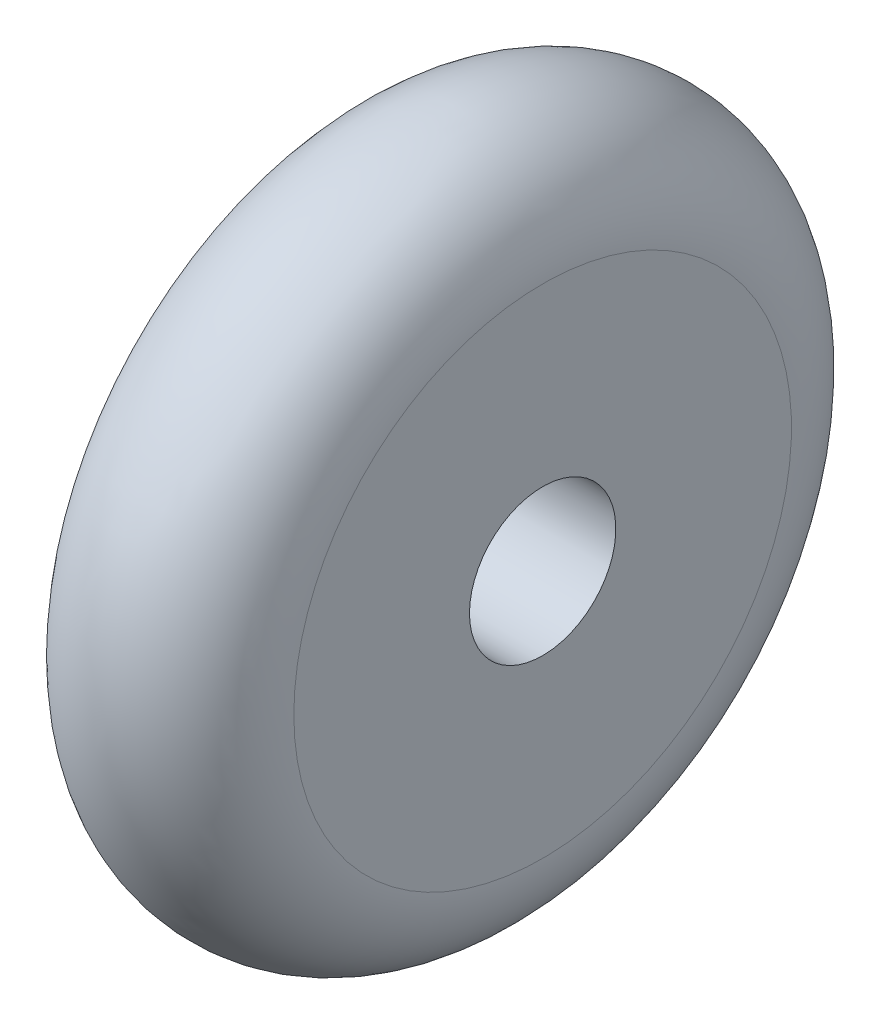
ISO-10303-21;
HEADER;
FILE_DESCRIPTION(('STEP AP214'),'2;1');
FILE_NAME('part.step','',(''),(''),'','','');
FILE_SCHEMA(('AUTOMOTIVE_DESIGN { 1 0 10303 214 1 1 1 1 }'));
ENDSEC;
DATA;
#1=APPLICATION_CONTEXT('core data for automotive mechanical design processes');
#2=APPLICATION_PROTOCOL_DEFINITION('international standard','automotive_design',2000,#1);
#3=PRODUCT_CONTEXT('',#1,'mechanical');
#4=PRODUCT('Part','Part','',(#3));
#5=PRODUCT_RELATED_PRODUCT_CATEGORY('part','',(#4));
#6=PRODUCT_DEFINITION_FORMATION('','',#4);
#7=PRODUCT_DEFINITION_CONTEXT('part definition',#1,'design');
#8=PRODUCT_DEFINITION('design','',#6,#7);
#9=PRODUCT_DEFINITION_SHAPE('','',#8);
#10=(LENGTH_UNIT() NAMED_UNIT(*) SI_UNIT(.MILLI.,.METRE.));
#11=(NAMED_UNIT(*) PLANE_ANGLE_UNIT() SI_UNIT($,.RADIAN.));
#12=(NAMED_UNIT(*) SI_UNIT($,.STERADIAN.) SOLID_ANGLE_UNIT());
#13=UNCERTAINTY_MEASURE_WITH_UNIT(LENGTH_MEASURE(1.E-05),#10,'distance_accuracy_value','');
#14=(GEOMETRIC_REPRESENTATION_CONTEXT(3) GLOBAL_UNCERTAINTY_ASSIGNED_CONTEXT((#13)) GLOBAL_UNIT_ASSIGNED_CONTEXT((#10,
#11,#12)) REPRESENTATION_CONTEXT('',''));
#15=CARTESIAN_POINT('',(0.,0.,0.));
#16=DIRECTION('',(0.,0.,1.));
#17=DIRECTION('',(1.,0.,0.));
#18=AXIS2_PLACEMENT_3D('',#15,#16,#17);
#19=CARTESIAN_POINT('',(0.,0.,0.));
#20=DIRECTION('',(-1.,0.,0.));
#21=DIRECTION('',(0.,0.,1.));
#22=AXIS2_PLACEMENT_3D('',#19,#20,#21);
#23=TOROIDAL_SURFACE('',#22,8.5,3.5);
#24=CARTESIAN_POINT('',(-3.5,0.,0.));
#25=DIRECTION('',(-1.,0.,0.));
#26=DIRECTION('',(0.,0.,1.));
#27=AXIS2_PLACEMENT_3D('',#24,#25,#26);
#28=CIRCLE('',#27,8.5);
#29=CARTESIAN_POINT('',(-3.5,0.,8.5));
#30=VERTEX_POINT('',#29);
#31=EDGE_CURVE('E46',#30,#30,#28,.T.);
#32=ORIENTED_EDGE('',*,*,#31,.F.);
#33=EDGE_LOOP('',(#32));
#34=FACE_BOUND('',#33,.T.);
#35=CARTESIAN_POINT('',(3.5,0.,0.));
#36=DIRECTION('',(-1.,0.,0.));
#37=DIRECTION('',(0.,0.,1.));
#38=AXIS2_PLACEMENT_3D('',#35,#36,#37);
#39=CIRCLE('',#38,8.5);
#40=CARTESIAN_POINT('',(3.5,0.,8.5));
#41=VERTEX_POINT('',#40);
#42=EDGE_CURVE('E10',#41,#41,#39,.T.);
#43=ORIENTED_EDGE('',*,*,#42,.T.);
#44=EDGE_LOOP('',(#43));
#45=FACE_BOUND('',#44,.T.);
#46=ADVANCED_FACE('F32',(#34,#45),#23,.T.);
#47=CARTESIAN_POINT('',(3.5,8.5,0.));
#48=DIRECTION('',(-1.,0.,0.));
#49=DIRECTION('',(0.,0.,1.));
#50=AXIS2_PLACEMENT_3D('',#47,#48,#49);
#51=PLANE('',#50);
#52=ORIENTED_EDGE('',*,*,#42,.F.);
#53=EDGE_LOOP('',(#52));
#54=FACE_BOUND('',#53,.T.);
#55=CARTESIAN_POINT('',(3.5,0.,0.));
#56=DIRECTION('',(-1.,0.,0.));
#57=DIRECTION('',(0.,0.,1.));
#58=AXIS2_PLACEMENT_3D('',#55,#56,#57);
#59=CIRCLE('',#58,2.5);
#60=CARTESIAN_POINT('',(3.5,0.,2.5));
#61=VERTEX_POINT('',#60);
#62=EDGE_CURVE('E38',#61,#61,#59,.T.);
#63=ORIENTED_EDGE('',*,*,#62,.T.);
#64=EDGE_LOOP('',(#63));
#65=FACE_BOUND('',#64,.T.);
#66=ADVANCED_FACE('F55',(#54,#65),#51,.F.);
#67=CARTESIAN_POINT('',(-3.5,0.,0.));
#68=DIRECTION('',(-1.,0.,0.));
#69=DIRECTION('',(0.,0.,1.));
#70=AXIS2_PLACEMENT_3D('',#67,#68,#69);
#71=CYLINDRICAL_SURFACE('',#70,2.5);
#72=ORIENTED_EDGE('',*,*,#62,.F.);
#73=EDGE_LOOP('',(#72));
#74=FACE_BOUND('',#73,.T.);
#75=CARTESIAN_POINT('',(-3.5,0.,0.));
#76=DIRECTION('',(-1.,0.,0.));
#77=DIRECTION('',(0.,0.,1.));
#78=AXIS2_PLACEMENT_3D('',#75,#76,#77);
#79=CIRCLE('',#78,2.5);
#80=CARTESIAN_POINT('',(-3.5,0.,2.5));
#81=VERTEX_POINT('',#80);
#82=EDGE_CURVE('E42',#81,#81,#79,.T.);
#83=ORIENTED_EDGE('',*,*,#82,.T.);
#84=EDGE_LOOP('',(#83));
#85=FACE_BOUND('',#84,.T.);
#86=ADVANCED_FACE('F59',(#74,#85),#71,.F.);
#87=CARTESIAN_POINT('',(-3.5,8.5,0.));
#88=DIRECTION('',(1.,0.,0.));
#89=DIRECTION('',(0.,0.,-1.));
#90=AXIS2_PLACEMENT_3D('',#87,#88,#89);
#91=PLANE('',#90);
#92=ORIENTED_EDGE('',*,*,#82,.F.);
#93=EDGE_LOOP('',(#92));
#94=FACE_BOUND('',#93,.T.);
#95=ORIENTED_EDGE('',*,*,#31,.T.);
#96=EDGE_LOOP('',(#95));
#97=FACE_BOUND('',#96,.T.);
#98=ADVANCED_FACE('F52',(#94,#97),#91,.F.);
#99=CLOSED_SHELL('',(#46,#66,#86,#98));
#100=MANIFOLD_SOLID_BREP('B2',#99);
#101=ADVANCED_BREP_SHAPE_REPRESENTATION('',(#18,#100),#14);
#102=SHAPE_DEFINITION_REPRESENTATION(#9,#101);
ENDSEC;
END-ISO-10303-21;
